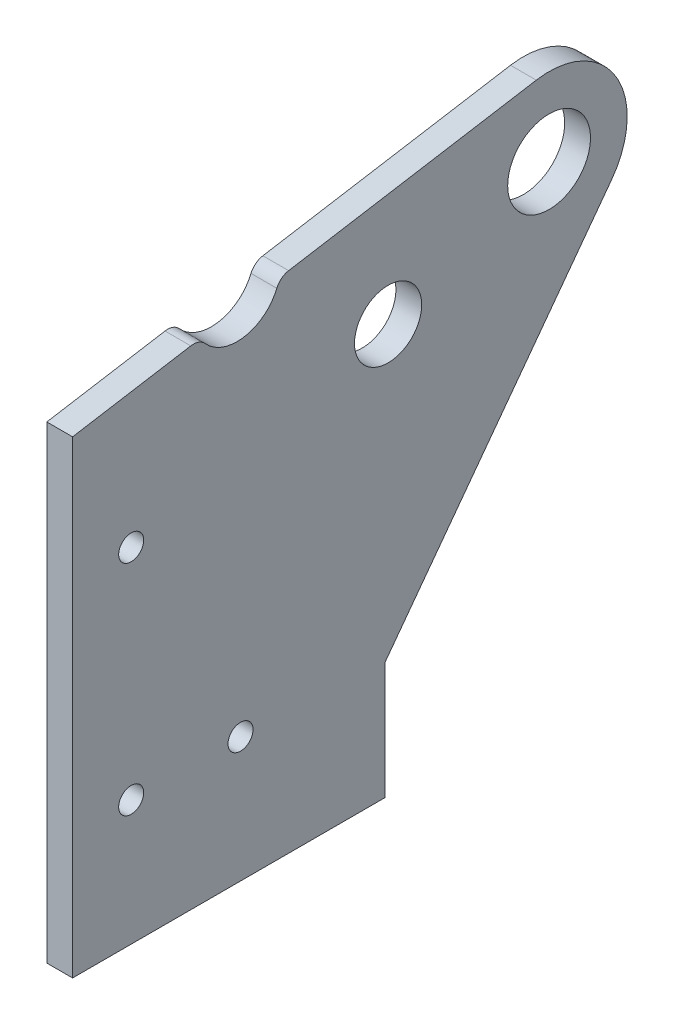
ISO-10303-21;
HEADER;
FILE_DESCRIPTION(('STEP AP214'),'2;1');
FILE_NAME('part.step','',(''),(''),'','','');
FILE_SCHEMA(('AUTOMOTIVE_DESIGN { 1 0 10303 214 1 1 1 1 }'));
ENDSEC;
DATA;
#1=APPLICATION_CONTEXT('core data for automotive mechanical design processes');
#2=APPLICATION_PROTOCOL_DEFINITION('international standard','automotive_design',2000,#1);
#3=PRODUCT_CONTEXT('',#1,'mechanical');
#4=PRODUCT('Part','Part','',(#3));
#5=PRODUCT_RELATED_PRODUCT_CATEGORY('part','',(#4));
#6=PRODUCT_DEFINITION_FORMATION('','',#4);
#7=PRODUCT_DEFINITION_CONTEXT('part definition',#1,'design');
#8=PRODUCT_DEFINITION('design','',#6,#7);
#9=PRODUCT_DEFINITION_SHAPE('','',#8);
#10=(LENGTH_UNIT() NAMED_UNIT(*) SI_UNIT(.MILLI.,.METRE.));
#11=(NAMED_UNIT(*) PLANE_ANGLE_UNIT() SI_UNIT($,.RADIAN.));
#12=(NAMED_UNIT(*) SI_UNIT($,.STERADIAN.) SOLID_ANGLE_UNIT());
#13=UNCERTAINTY_MEASURE_WITH_UNIT(LENGTH_MEASURE(1.E-05),#10,'distance_accuracy_value','');
#14=(GEOMETRIC_REPRESENTATION_CONTEXT(3) GLOBAL_UNCERTAINTY_ASSIGNED_CONTEXT((#13)) GLOBAL_UNIT_ASSIGNED_CONTEXT((#10,
#11,#12)) REPRESENTATION_CONTEXT('',''));
#15=CARTESIAN_POINT('',(0.,0.,0.));
#16=DIRECTION('',(0.,0.,1.));
#17=DIRECTION('',(1.,0.,0.));
#18=AXIS2_PLACEMENT_3D('',#15,#16,#17);
#19=CARTESIAN_POINT('',(-142.304563586628,60.,61.));
#20=DIRECTION('',(0.,-0.986471238251173,-0.163934426229508));
#21=DIRECTION('',(0.,0.163934426229508,-0.986471238251173));
#22=AXIS2_PLACEMENT_3D('',#19,#20,#21);
#23=PLANE('',#22);
#24=DIRECTION('',(0.,0.163934426229508,-0.986471238251173));
#25=VECTOR('',#24,1.);
#26=CARTESIAN_POINT('',(-39.,60.,61.));
#27=LINE('',#26,#25);
#28=CARTESIAN_POINT('',(-39.,60.,61.));
#29=VERTEX_POINT('',#28);
#30=CARTESIAN_POINT('',(-39.,62.5150021736932,45.8660384182263));
#31=VERTEX_POINT('',#30);
#32=EDGE_CURVE('E167',#29,#31,#27,.T.);
#33=ORIENTED_EDGE('',*,*,#32,.T.);
#34=DIRECTION('',(-1.,0.,0.));
#35=VECTOR('',#34,1.);
#36=CARTESIAN_POINT('',(-142.304563586628,62.5150021736932,45.8660384182263));
#37=LINE('',#36,#35);
#38=CARTESIAN_POINT('',(-42.3,62.5150021736932,45.8660384182262));
#39=VERTEX_POINT('',#38);
#40=EDGE_CURVE('E189',#31,#39,#37,.T.);
#41=ORIENTED_EDGE('',*,*,#40,.T.);
#42=DIRECTION('',(0.,0.163934426229508,-0.986471238251173));
#43=VECTOR('',#42,1.);
#44=CARTESIAN_POINT('',(-42.3,60.,61.));
#45=LINE('',#44,#43);
#46=CARTESIAN_POINT('',(-42.3,60.,61.));
#47=VERTEX_POINT('',#46);
#48=EDGE_CURVE('E138',#47,#39,#45,.T.);
#49=ORIENTED_EDGE('',*,*,#48,.F.);
#50=DIRECTION('',(1.,0.,0.));
#51=VECTOR('',#50,1.);
#52=CARTESIAN_POINT('',(-142.304563586628,60.,61.));
#53=LINE('',#52,#51);
#54=EDGE_CURVE('E134',#47,#29,#53,.T.);
#55=ORIENTED_EDGE('',*,*,#54,.T.);
#56=EDGE_LOOP('',(#33,#41,#49,#55));
#57=FACE_BOUND('',#56,.T.);
#58=ADVANCED_FACE('F38',(#57),#23,.F.);
#59=CARTESIAN_POINT('',(-142.304563586628,0.,61.));
#60=DIRECTION('',(0.,1.,0.));
#61=DIRECTION('',(0.,0.,1.));
#62=AXIS2_PLACEMENT_3D('',#59,#60,#61);
#63=PLANE('',#62);
#64=DIRECTION('',(0.,0.,1.));
#65=VECTOR('',#64,1.);
#66=CARTESIAN_POINT('',(-42.3,0.,61.));
#67=LINE('',#66,#65);
#68=CARTESIAN_POINT('',(-42.3,0.,21.));
#69=VERTEX_POINT('',#68);
#70=CARTESIAN_POINT('',(-42.3,0.,61.));
#71=VERTEX_POINT('',#70);
#72=EDGE_CURVE('E121',#69,#71,#67,.T.);
#73=ORIENTED_EDGE('',*,*,#72,.F.);
#74=DIRECTION('',(1.,0.,0.));
#75=VECTOR('',#74,1.);
#76=CARTESIAN_POINT('',(-142.304563586628,0.,21.));
#77=LINE('',#76,#75);
#78=CARTESIAN_POINT('',(-39.,0.,21.));
#79=VERTEX_POINT('',#78);
#80=EDGE_CURVE('E128',#69,#79,#77,.T.);
#81=ORIENTED_EDGE('',*,*,#80,.T.);
#82=DIRECTION('',(0.,0.,1.));
#83=VECTOR('',#82,1.);
#84=CARTESIAN_POINT('',(-39.,0.,61.));
#85=LINE('',#84,#83);
#86=CARTESIAN_POINT('',(-39.,0.,61.));
#87=VERTEX_POINT('',#86);
#88=EDGE_CURVE('E124',#79,#87,#85,.T.);
#89=ORIENTED_EDGE('',*,*,#88,.T.);
#90=DIRECTION('',(1.,0.,0.));
#91=VECTOR('',#90,1.);
#92=CARTESIAN_POINT('',(-142.304563586628,0.,61.));
#93=LINE('',#92,#91);
#94=EDGE_CURVE('E117',#71,#87,#93,.T.);
#95=ORIENTED_EDGE('',*,*,#94,.F.);
#96=EDGE_LOOP('',(#73,#81,#89,#95));
#97=FACE_BOUND('',#96,.T.);
#98=ADVANCED_FACE('F119',(#97),#63,.F.);
#99=CARTESIAN_POINT('',(-142.304563586628,15.,21.));
#100=DIRECTION('',(0.,0.,1.));
#101=DIRECTION('',(1.,0.,0.));
#102=AXIS2_PLACEMENT_3D('',#99,#100,#101);
#103=PLANE('',#102);
#104=DIRECTION('',(0.,-1.,0.));
#105=VECTOR('',#104,1.);
#106=CARTESIAN_POINT('',(-42.3,15.,21.));
#107=LINE('',#106,#105);
#108=CARTESIAN_POINT('',(-42.3,15.,21.));
#109=VERTEX_POINT('',#108);
#110=EDGE_CURVE('E143',#109,#69,#107,.T.);
#111=ORIENTED_EDGE('',*,*,#110,.F.);
#112=DIRECTION('',(1.,0.,0.));
#113=VECTOR('',#112,1.);
#114=CARTESIAN_POINT('',(-142.304563586628,15.,21.));
#115=LINE('',#114,#113);
#116=CARTESIAN_POINT('',(-39.,15.,21.));
#117=VERTEX_POINT('',#116);
#118=EDGE_CURVE('E181',#109,#117,#115,.T.);
#119=ORIENTED_EDGE('',*,*,#118,.T.);
#120=DIRECTION('',(0.,-1.,0.));
#121=VECTOR('',#120,1.);
#122=CARTESIAN_POINT('',(-39.,15.,21.));
#123=LINE('',#122,#121);
#124=EDGE_CURVE('E176',#117,#79,#123,.T.);
#125=ORIENTED_EDGE('',*,*,#124,.T.);
#126=ORIENTED_EDGE('',*,*,#80,.F.);
#127=EDGE_LOOP('',(#111,#119,#125,#126));
#128=FACE_BOUND('',#127,.T.);
#129=ADVANCED_FACE('F266',(#128),#103,.F.);
#130=CARTESIAN_POINT('',(-142.304563586628,54.03295836744,-8.0246130221523));
#131=DIRECTION('',(0.,0.596704163255996,0.802461302215229));
#132=DIRECTION('',(0.,-0.802461302215229,0.596704163255996));
#133=AXIS2_PLACEMENT_3D('',#130,#131,#132);
#134=PLANE('',#133);
#135=DIRECTION('',(0.,-0.802461302215229,0.596704163255996));
#136=VECTOR('',#135,1.);
#137=CARTESIAN_POINT('',(-42.3,54.03295836744,-8.0246130221523));
#138=LINE('',#137,#136);
#139=CARTESIAN_POINT('',(-42.3,54.03295836744,-8.0246130221523));
#140=VERTEX_POINT('',#139);
#141=EDGE_CURVE('E146',#140,#109,#138,.T.);
#142=ORIENTED_EDGE('',*,*,#141,.F.);
#143=DIRECTION('',(1.,0.,0.));
#144=VECTOR('',#143,1.);
#145=CARTESIAN_POINT('',(-142.304563586628,54.03295836744,-8.0246130221523));
#146=LINE('',#145,#144);
#147=CARTESIAN_POINT('',(-39.,54.03295836744,-8.0246130221523));
#148=VERTEX_POINT('',#147);
#149=EDGE_CURVE('E183',#140,#148,#146,.T.);
#150=ORIENTED_EDGE('',*,*,#149,.T.);
#151=DIRECTION('',(0.,-0.802461302215229,0.596704163255996));
#152=VECTOR('',#151,1.);
#153=CARTESIAN_POINT('',(-39.,54.03295836744,-8.0246130221523));
#154=LINE('',#153,#152);
#155=EDGE_CURVE('E173',#148,#117,#154,.T.);
#156=ORIENTED_EDGE('',*,*,#155,.T.);
#157=ORIENTED_EDGE('',*,*,#118,.F.);
#158=EDGE_LOOP('',(#142,#150,#156,#157));
#159=FACE_BOUND('',#158,.T.);
#160=ADVANCED_FACE('F277',(#159),#134,.F.);
#161=CARTESIAN_POINT('',(-142.304563586628,60.,0.));
#162=DIRECTION('',(1.,0.,0.));
#163=DIRECTION('',(0.,0.,-1.));
#164=AXIS2_PLACEMENT_3D('',#161,#162,#163);
#165=CYLINDRICAL_SURFACE('',#164,10.);
#166=CARTESIAN_POINT('',(-42.3,60.,0.));
#167=DIRECTION('',(-1.,0.,0.));
#168=DIRECTION('',(0.,0.,1.));
#169=AXIS2_PLACEMENT_3D('',#166,#167,#168);
#170=CIRCLE('',#169,10.);
#171=CARTESIAN_POINT('',(-42.3,69.8647123825117,1.63934426229508));
#172=VERTEX_POINT('',#171);
#173=EDGE_CURVE('E154',#172,#140,#170,.T.);
#174=ORIENTED_EDGE('',*,*,#173,.F.);
#175=DIRECTION('',(1.,0.,0.));
#176=VECTOR('',#175,1.);
#177=CARTESIAN_POINT('',(-142.304563586628,69.8647123825117,1.63934426229508));
#178=LINE('',#177,#176);
#179=CARTESIAN_POINT('',(-39.,69.8647123825117,1.63934426229508));
#180=VERTEX_POINT('',#179);
#181=EDGE_CURVE('E185',#172,#180,#178,.T.);
#182=ORIENTED_EDGE('',*,*,#181,.T.);
#183=CARTESIAN_POINT('',(-39.,60.,0.));
#184=DIRECTION('',(-1.,0.,0.));
#185=DIRECTION('',(0.,0.,-1.));
#186=AXIS2_PLACEMENT_3D('',#183,#184,#185);
#187=CIRCLE('',#186,10.);
#188=EDGE_CURVE('E170',#180,#148,#187,.T.);
#189=ORIENTED_EDGE('',*,*,#188,.T.);
#190=ORIENTED_EDGE('',*,*,#149,.F.);
#191=EDGE_LOOP('',(#174,#182,#189,#190));
#192=FACE_BOUND('',#191,.T.);
#193=ADVANCED_FACE('F271',(#192),#165,.T.);
#194=CARTESIAN_POINT('',(-42.3,64.5962330927822,33.3422843230001));
#195=VERTEX_POINT('',#194);
#196=EDGE_CURVE('E157',#195,#172,#45,.T.);
#197=ORIENTED_EDGE('',*,*,#196,.F.);
#198=DIRECTION('',(-1.,0.,0.));
#199=VECTOR('',#198,1.);
#200=CARTESIAN_POINT('',(-142.304563586628,64.5962330927822,33.3422843230001));
#201=LINE('',#200,#199);
#202=CARTESIAN_POINT('',(-39.,64.5962330927822,33.3422843230001));
#203=VERTEX_POINT('',#202);
#204=EDGE_CURVE('E12',#195,#203,#201,.F.);
#205=ORIENTED_EDGE('',*,*,#204,.T.);
#206=EDGE_CURVE('E166',#203,#180,#27,.T.);
#207=ORIENTED_EDGE('',*,*,#206,.T.);
#208=ORIENTED_EDGE('',*,*,#181,.F.);
#209=EDGE_LOOP('',(#197,#205,#207,#208));
#210=FACE_BOUND('',#209,.T.);
#211=ADVANCED_FACE('F262',(#210),#23,.F.);
#212=CARTESIAN_POINT('',(-142.304563586628,60.,61.));
#213=DIRECTION('',(0.,0.,-1.));
#214=DIRECTION('',(0.,1.,0.));
#215=AXIS2_PLACEMENT_3D('',#212,#213,#214);
#216=PLANE('',#215);
#217=DIRECTION('',(0.,1.,0.));
#218=VECTOR('',#217,1.);
#219=CARTESIAN_POINT('',(-42.3,60.,61.));
#220=LINE('',#219,#218);
#221=EDGE_CURVE('E132',#71,#47,#220,.T.);
#222=ORIENTED_EDGE('',*,*,#221,.F.);
#223=ORIENTED_EDGE('',*,*,#94,.T.);
#224=DIRECTION('',(0.,1.,0.));
#225=VECTOR('',#224,1.);
#226=CARTESIAN_POINT('',(-39.,60.,61.));
#227=LINE('',#226,#225);
#228=EDGE_CURVE('E164',#87,#29,#227,.T.);
#229=ORIENTED_EDGE('',*,*,#228,.T.);
#230=ORIENTED_EDGE('',*,*,#54,.F.);
#231=EDGE_LOOP('',(#222,#223,#229,#230));
#232=FACE_BOUND('',#231,.T.);
#233=ADVANCED_FACE('F133',(#232),#216,.F.);
#234=CARTESIAN_POINT('',(-142.304563586628,60.,0.));
#235=DIRECTION('',(1.,0.,0.));
#236=DIRECTION('',(0.,0.,-1.));
#237=AXIS2_PLACEMENT_3D('',#234,#235,#236);
#238=CYLINDRICAL_SURFACE('',#237,5.2999999999998);
#239=CARTESIAN_POINT('',(-39.,60.,0.));
#240=DIRECTION('',(-1.,0.,0.));
#241=DIRECTION('',(0.,0.,1.));
#242=AXIS2_PLACEMENT_3D('',#239,#240,#241);
#243=CIRCLE('',#242,5.2999999999998);
#244=CARTESIAN_POINT('',(-39.,60.,5.2999999999998));
#245=VERTEX_POINT('',#244);
#246=EDGE_CURVE('E161',#245,#245,#243,.T.);
#247=ORIENTED_EDGE('',*,*,#246,.F.);
#248=EDGE_LOOP('',(#247));
#249=FACE_BOUND('',#248,.T.);
#250=CARTESIAN_POINT('',(-42.3,60.,0.));
#251=DIRECTION('',(-1.,0.,0.));
#252=DIRECTION('',(0.,0.,1.));
#253=AXIS2_PLACEMENT_3D('',#250,#251,#252);
#254=CIRCLE('',#253,5.2999999999998);
#255=CARTESIAN_POINT('',(-42.3,60.,5.2999999999998));
#256=VERTEX_POINT('',#255);
#257=EDGE_CURVE('E144',#256,#256,#254,.T.);
#258=ORIENTED_EDGE('',*,*,#257,.T.);
#259=EDGE_LOOP('',(#258));
#260=FACE_BOUND('',#259,.T.);
#261=ADVANCED_FACE('F241',(#249,#260),#238,.F.);
#262=CARTESIAN_POINT('',(-39.,60.,0.));
#263=DIRECTION('',(1.,0.,0.));
#264=DIRECTION('',(0.,0.,-1.));
#265=AXIS2_PLACEMENT_3D('',#262,#263,#264);
#266=PLANE('',#265);
#267=CARTESIAN_POINT('',(-39.,44.,53.5));
#268=DIRECTION('',(1.,0.,0.));
#269=DIRECTION('',(0.,0.,-1.));
#270=AXIS2_PLACEMENT_3D('',#267,#268,#269);
#271=CIRCLE('',#270,1.6);
#272=CARTESIAN_POINT('',(-39.,44.,51.9));
#273=VERTEX_POINT('',#272);
#274=EDGE_CURVE('E218',#273,#273,#271,.T.);
#275=ORIENTED_EDGE('',*,*,#274,.F.);
#276=EDGE_LOOP('',(#275));
#277=FACE_BOUND('',#276,.T.);
#278=CARTESIAN_POINT('',(-39.,16.,39.5));
#279=DIRECTION('',(1.,0.,0.));
#280=DIRECTION('',(0.,0.,-1.));
#281=AXIS2_PLACEMENT_3D('',#278,#279,#280);
#282=CIRCLE('',#281,1.6);
#283=CARTESIAN_POINT('',(-39.,16.,37.9));
#284=VERTEX_POINT('',#283);
#285=EDGE_CURVE('E227',#284,#284,#282,.T.);
#286=ORIENTED_EDGE('',*,*,#285,.F.);
#287=EDGE_LOOP('',(#286));
#288=FACE_BOUND('',#287,.T.);
#289=CARTESIAN_POINT('',(-39.,16.,53.5));
#290=DIRECTION('',(1.,0.,0.));
#291=DIRECTION('',(0.,0.,-1.));
#292=AXIS2_PLACEMENT_3D('',#289,#290,#291);
#293=CIRCLE('',#292,1.6);
#294=CARTESIAN_POINT('',(-39.,16.,51.9));
#295=VERTEX_POINT('',#294);
#296=EDGE_CURVE('E221',#295,#295,#293,.T.);
#297=ORIENTED_EDGE('',*,*,#296,.F.);
#298=EDGE_LOOP('',(#297));
#299=FACE_BOUND('',#298,.T.);
#300=CARTESIAN_POINT('',(-39.,65.5231326726555,39.9311282770753));
#301=DIRECTION('',(-1.,0.,0.));
#302=DIRECTION('',(0.,0.,1.));
#303=AXIS2_PLACEMENT_3D('',#300,#301,#302);
#304=CIRCLE('',#303,5.5);
#305=CARTESIAN_POINT('',(-39.,63.3965818313133,34.8588722189502));
#306=VERTEX_POINT('',#305);
#307=CARTESIAN_POINT('',(-39.,61.8703458239814,44.0429585554494));
#308=VERTEX_POINT('',#307);
#309=EDGE_CURVE('E192',#306,#308,#304,.T.);
#310=ORIENTED_EDGE('',*,*,#309,.T.);
#311=CARTESIAN_POINT('',(-39.,60.5420596971908,45.5381695657672));
#312=DIRECTION('',(1.,0.,0.));
#313=DIRECTION('',(0.,0.,-1.));
#314=AXIS2_PLACEMENT_3D('',#311,#312,#313);
#315=CIRCLE('',#314,2.);
#316=EDGE_CURVE('E46',#308,#31,#315,.T.);
#317=ORIENTED_EDGE('',*,*,#316,.T.);
#318=ORIENTED_EDGE('',*,*,#32,.F.);
#319=ORIENTED_EDGE('',*,*,#228,.F.);
#320=ORIENTED_EDGE('',*,*,#88,.F.);
#321=ORIENTED_EDGE('',*,*,#124,.F.);
#322=ORIENTED_EDGE('',*,*,#155,.F.);
#323=ORIENTED_EDGE('',*,*,#188,.F.);
#324=ORIENTED_EDGE('',*,*,#206,.F.);
#325=CARTESIAN_POINT('',(-39.,62.6232906162798,33.0144154705411));
#326=DIRECTION('',(1.,0.,0.));
#327=DIRECTION('',(0.,0.,-1.));
#328=AXIS2_PLACEMENT_3D('',#325,#326,#327);
#329=CIRCLE('',#328,2.);
#330=EDGE_CURVE('E53',#203,#306,#329,.T.);
#331=ORIENTED_EDGE('',*,*,#330,.T.);
#332=EDGE_LOOP('',(#310,#317,#318,#319,#320,#321,#322,#323,#324,#331));
#333=FACE_BOUND('',#332,.T.);
#334=ORIENTED_EDGE('',*,*,#246,.T.);
#335=EDGE_LOOP('',(#334));
#336=FACE_BOUND('',#335,.T.);
#337=CARTESIAN_POINT('',(-39.,52.3030615433006,20.6096370272206));
#338=DIRECTION('',(-1.,0.,0.));
#339=DIRECTION('',(0.,0.,1.));
#340=AXIS2_PLACEMENT_3D('',#337,#338,#339);
#341=CIRCLE('',#340,4.3);
#342=CARTESIAN_POINT('',(-39.,52.3030615433006,24.9096370272206));
#343=VERTEX_POINT('',#342);
#344=EDGE_CURVE('E137',#343,#343,#341,.T.);
#345=ORIENTED_EDGE('',*,*,#344,.T.);
#346=EDGE_LOOP('',(#345));
#347=FACE_BOUND('',#346,.T.);
#348=ADVANCED_FACE('F205',(#277,#288,#299,#333,#336,#347),#266,.T.);
#349=CARTESIAN_POINT('',(-142.304563586628,52.3030615433006,20.6096370272206));
#350=DIRECTION('',(1.,0.,0.));
#351=DIRECTION('',(0.,0.,-1.));
#352=AXIS2_PLACEMENT_3D('',#349,#350,#351);
#353=CYLINDRICAL_SURFACE('',#352,4.3);
#354=ORIENTED_EDGE('',*,*,#344,.F.);
#355=EDGE_LOOP('',(#354));
#356=FACE_BOUND('',#355,.T.);
#357=CARTESIAN_POINT('',(-42.3,52.3030615433006,20.6096370272206));
#358=DIRECTION('',(-1.,0.,0.));
#359=DIRECTION('',(0.,0.,1.));
#360=AXIS2_PLACEMENT_3D('',#357,#358,#359);
#361=CIRCLE('',#360,4.3);
#362=CARTESIAN_POINT('',(-42.3,52.3030615433006,24.9096370272206));
#363=VERTEX_POINT('',#362);
#364=EDGE_CURVE('E149',#363,#363,#361,.T.);
#365=ORIENTED_EDGE('',*,*,#364,.T.);
#366=EDGE_LOOP('',(#365));
#367=FACE_BOUND('',#366,.T.);
#368=ADVANCED_FACE('F240',(#356,#367),#353,.F.);
#369=CARTESIAN_POINT('',(-42.3,60.,0.));
#370=DIRECTION('',(-1.,0.,0.));
#371=DIRECTION('',(0.,0.,1.));
#372=AXIS2_PLACEMENT_3D('',#369,#370,#371);
#373=PLANE('',#372);
#374=CARTESIAN_POINT('',(-42.3,44.,53.5));
#375=DIRECTION('',(1.,0.,0.));
#376=DIRECTION('',(0.,0.,-1.));
#377=AXIS2_PLACEMENT_3D('',#374,#375,#376);
#378=CIRCLE('',#377,1.6);
#379=CARTESIAN_POINT('',(-42.3,44.,51.9));
#380=VERTEX_POINT('',#379);
#381=EDGE_CURVE('E215',#380,#380,#378,.T.);
#382=ORIENTED_EDGE('',*,*,#381,.T.);
#383=EDGE_LOOP('',(#382));
#384=FACE_BOUND('',#383,.T.);
#385=CARTESIAN_POINT('',(-42.3,16.,39.5));
#386=DIRECTION('',(1.,0.,0.));
#387=DIRECTION('',(0.,0.,-1.));
#388=AXIS2_PLACEMENT_3D('',#385,#386,#387);
#389=CIRCLE('',#388,1.6);
#390=CARTESIAN_POINT('',(-42.3,16.,37.9));
#391=VERTEX_POINT('',#390);
#392=EDGE_CURVE('E230',#391,#391,#389,.T.);
#393=ORIENTED_EDGE('',*,*,#392,.T.);
#394=EDGE_LOOP('',(#393));
#395=FACE_BOUND('',#394,.T.);
#396=CARTESIAN_POINT('',(-42.3,16.,53.5));
#397=DIRECTION('',(1.,0.,0.));
#398=DIRECTION('',(0.,0.,-1.));
#399=AXIS2_PLACEMENT_3D('',#396,#397,#398);
#400=CIRCLE('',#399,1.6);
#401=CARTESIAN_POINT('',(-42.3,16.,51.9));
#402=VERTEX_POINT('',#401);
#403=EDGE_CURVE('E224',#402,#402,#400,.T.);
#404=ORIENTED_EDGE('',*,*,#403,.T.);
#405=EDGE_LOOP('',(#404));
#406=FACE_BOUND('',#405,.T.);
#407=ORIENTED_EDGE('',*,*,#48,.T.);
#408=CARTESIAN_POINT('',(-42.3,60.5420596971908,45.5381695657672));
#409=DIRECTION('',(-1.,0.,0.));
#410=DIRECTION('',(0.,0.,1.));
#411=AXIS2_PLACEMENT_3D('',#408,#409,#410);
#412=CIRCLE('',#411,2.);
#413=CARTESIAN_POINT('',(-42.3,61.8703458239814,44.0429585554494));
#414=VERTEX_POINT('',#413);
#415=EDGE_CURVE('E197',#39,#414,#412,.T.);
#416=ORIENTED_EDGE('',*,*,#415,.T.);
#417=CARTESIAN_POINT('',(-42.3,65.5231326726555,39.9311282770753));
#418=DIRECTION('',(-1.,0.,0.));
#419=DIRECTION('',(0.,0.,1.));
#420=AXIS2_PLACEMENT_3D('',#417,#418,#419);
#421=CIRCLE('',#420,5.5);
#422=CARTESIAN_POINT('',(-42.3,63.3965818313133,34.8588722189502));
#423=VERTEX_POINT('',#422);
#424=EDGE_CURVE('E212',#423,#414,#421,.T.);
#425=ORIENTED_EDGE('',*,*,#424,.F.);
#426=CARTESIAN_POINT('',(-42.3,62.6232906162798,33.0144154705411));
#427=DIRECTION('',(-1.,0.,0.));
#428=DIRECTION('',(0.,0.,1.));
#429=AXIS2_PLACEMENT_3D('',#426,#427,#428);
#430=CIRCLE('',#429,2.);
#431=EDGE_CURVE('E195',#423,#195,#430,.T.);
#432=ORIENTED_EDGE('',*,*,#431,.T.);
#433=ORIENTED_EDGE('',*,*,#196,.T.);
#434=ORIENTED_EDGE('',*,*,#173,.T.);
#435=ORIENTED_EDGE('',*,*,#141,.T.);
#436=ORIENTED_EDGE('',*,*,#110,.T.);
#437=ORIENTED_EDGE('',*,*,#72,.T.);
#438=ORIENTED_EDGE('',*,*,#221,.T.);
#439=EDGE_LOOP('',(#407,#416,#425,#432,#433,#434,#435,#436,#437,#438));
#440=FACE_BOUND('',#439,.T.);
#441=ORIENTED_EDGE('',*,*,#364,.F.);
#442=EDGE_LOOP('',(#441));
#443=FACE_BOUND('',#442,.T.);
#444=ORIENTED_EDGE('',*,*,#257,.F.);
#445=EDGE_LOOP('',(#444));
#446=FACE_BOUND('',#445,.T.);
#447=ADVANCED_FACE('F140',(#384,#395,#406,#440,#443,#446),#373,.T.);
#448=CARTESIAN_POINT('',(-39.,65.5231326726555,39.9311282770753));
#449=DIRECTION('',(-1.,0.,0.));
#450=DIRECTION('',(0.,0.,1.));
#451=AXIS2_PLACEMENT_3D('',#448,#449,#450);
#452=CYLINDRICAL_SURFACE('',#451,5.5);
#453=ORIENTED_EDGE('',*,*,#424,.T.);
#454=DIRECTION('',(-1.,0.,0.));
#455=VECTOR('',#454,1.);
#456=CARTESIAN_POINT('',(-39.,61.8703458239814,44.0429585554494));
#457=LINE('',#456,#455);
#458=EDGE_CURVE('E60',#414,#308,#457,.F.);
#459=ORIENTED_EDGE('',*,*,#458,.T.);
#460=ORIENTED_EDGE('',*,*,#309,.F.);
#461=DIRECTION('',(-1.,0.,0.));
#462=VECTOR('',#461,1.);
#463=CARTESIAN_POINT('',(-39.,63.3965818313133,34.8588722189502));
#464=LINE('',#463,#462);
#465=EDGE_CURVE('E199',#306,#423,#464,.T.);
#466=ORIENTED_EDGE('',*,*,#465,.T.);
#467=EDGE_LOOP('',(#453,#459,#460,#466));
#468=FACE_BOUND('',#467,.T.);
#469=ADVANCED_FACE('F214',(#468),#452,.F.);
#470=CARTESIAN_POINT('',(-39.,60.5420596971908,45.5381695657672));
#471=DIRECTION('',(-1.,0.,0.));
#472=DIRECTION('',(0.,0.,1.));
#473=AXIS2_PLACEMENT_3D('',#470,#471,#472);
#474=CYLINDRICAL_SURFACE('',#473,2.);
#475=ORIENTED_EDGE('',*,*,#316,.F.);
#476=ORIENTED_EDGE('',*,*,#458,.F.);
#477=ORIENTED_EDGE('',*,*,#415,.F.);
#478=ORIENTED_EDGE('',*,*,#40,.F.);
#479=EDGE_LOOP('',(#475,#476,#477,#478));
#480=FACE_BOUND('',#479,.T.);
#481=ADVANCED_FACE('F210',(#480),#474,.T.);
#482=CARTESIAN_POINT('',(-39.,62.6232906162798,33.0144154705411));
#483=DIRECTION('',(-1.,0.,0.));
#484=DIRECTION('',(0.,0.,1.));
#485=AXIS2_PLACEMENT_3D('',#482,#483,#484);
#486=CYLINDRICAL_SURFACE('',#485,2.);
#487=ORIENTED_EDGE('',*,*,#431,.F.);
#488=ORIENTED_EDGE('',*,*,#465,.F.);
#489=ORIENTED_EDGE('',*,*,#330,.F.);
#490=ORIENTED_EDGE('',*,*,#204,.F.);
#491=EDGE_LOOP('',(#487,#488,#489,#490));
#492=FACE_BOUND('',#491,.T.);
#493=ADVANCED_FACE('F40',(#492),#486,.T.);
#494=CARTESIAN_POINT('',(-42.3,16.,53.5));
#495=DIRECTION('',(1.,0.,0.));
#496=DIRECTION('',(0.,0.,-1.));
#497=AXIS2_PLACEMENT_3D('',#494,#495,#496);
#498=CYLINDRICAL_SURFACE('',#497,1.6);
#499=ORIENTED_EDGE('',*,*,#403,.F.);
#500=EDGE_LOOP('',(#499));
#501=FACE_BOUND('',#500,.T.);
#502=ORIENTED_EDGE('',*,*,#296,.T.);
#503=EDGE_LOOP('',(#502));
#504=FACE_BOUND('',#503,.T.);
#505=ADVANCED_FACE('F247',(#501,#504),#498,.F.);
#506=CARTESIAN_POINT('',(-42.3,16.,39.5));
#507=DIRECTION('',(1.,0.,0.));
#508=DIRECTION('',(0.,0.,-1.));
#509=AXIS2_PLACEMENT_3D('',#506,#507,#508);
#510=CYLINDRICAL_SURFACE('',#509,1.6);
#511=ORIENTED_EDGE('',*,*,#392,.F.);
#512=EDGE_LOOP('',(#511));
#513=FACE_BOUND('',#512,.T.);
#514=ORIENTED_EDGE('',*,*,#285,.T.);
#515=EDGE_LOOP('',(#514));
#516=FACE_BOUND('',#515,.T.);
#517=ADVANCED_FACE('F249',(#513,#516),#510,.F.);
#518=CARTESIAN_POINT('',(-42.3,44.,53.5));
#519=DIRECTION('',(1.,0.,0.));
#520=DIRECTION('',(0.,0.,-1.));
#521=AXIS2_PLACEMENT_3D('',#518,#519,#520);
#522=CYLINDRICAL_SURFACE('',#521,1.6);
#523=ORIENTED_EDGE('',*,*,#381,.F.);
#524=EDGE_LOOP('',(#523));
#525=FACE_BOUND('',#524,.T.);
#526=ORIENTED_EDGE('',*,*,#274,.T.);
#527=EDGE_LOOP('',(#526));
#528=FACE_BOUND('',#527,.T.);
#529=ADVANCED_FACE('F236',(#525,#528),#522,.F.);
#530=CLOSED_SHELL('',(#58,#98,#129,#160,#193,#211,#233,#261,#348,#368,#447,#469,#481,#493,#505,
#517,#529));
#531=MANIFOLD_SOLID_BREP('B2',#530);
#532=ADVANCED_BREP_SHAPE_REPRESENTATION('',(#18,#531),#14);
#533=SHAPE_DEFINITION_REPRESENTATION(#9,#532);
ENDSEC;
END-ISO-10303-21;
